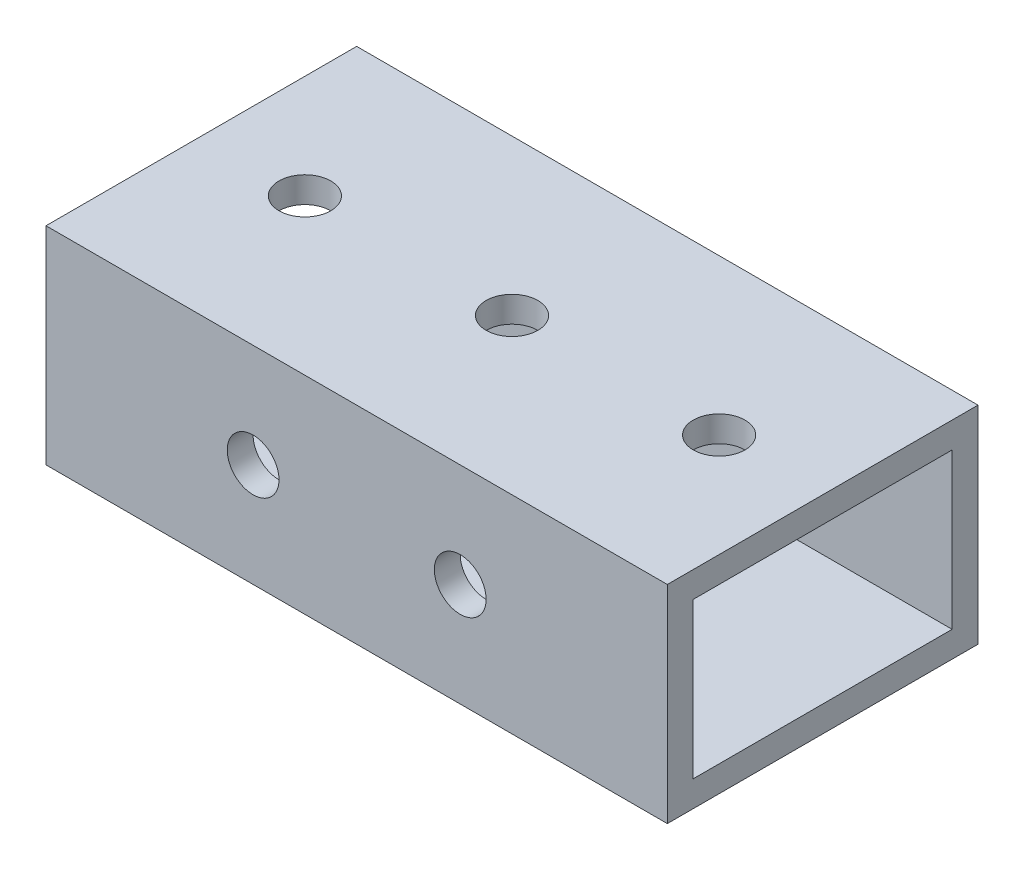
ISO-10303-21;
HEADER;
FILE_DESCRIPTION(('STEP AP214'),'2;1');
FILE_NAME('part.step','',(''),(''),'','','');
FILE_SCHEMA(('AUTOMOTIVE_DESIGN { 1 0 10303 214 1 1 1 1 }'));
ENDSEC;
DATA;
#1=APPLICATION_CONTEXT('core data for automotive mechanical design processes');
#2=APPLICATION_PROTOCOL_DEFINITION('international standard','automotive_design',2000,#1);
#3=PRODUCT_CONTEXT('',#1,'mechanical');
#4=PRODUCT('Part','Part','',(#3));
#5=PRODUCT_RELATED_PRODUCT_CATEGORY('part','',(#4));
#6=PRODUCT_DEFINITION_FORMATION('','',#4);
#7=PRODUCT_DEFINITION_CONTEXT('part definition',#1,'design');
#8=PRODUCT_DEFINITION('design','',#6,#7);
#9=PRODUCT_DEFINITION_SHAPE('','',#8);
#10=(LENGTH_UNIT() NAMED_UNIT(*) SI_UNIT(.MILLI.,.METRE.));
#11=(NAMED_UNIT(*) PLANE_ANGLE_UNIT() SI_UNIT($,.RADIAN.));
#12=(NAMED_UNIT(*) SI_UNIT($,.STERADIAN.) SOLID_ANGLE_UNIT());
#13=UNCERTAINTY_MEASURE_WITH_UNIT(LENGTH_MEASURE(1.E-05),#10,'distance_accuracy_value','');
#14=(GEOMETRIC_REPRESENTATION_CONTEXT(3) GLOBAL_UNCERTAINTY_ASSIGNED_CONTEXT((#13)) GLOBAL_UNIT_ASSIGNED_CONTEXT((#10,
#11,#12)) REPRESENTATION_CONTEXT('',''));
#15=CARTESIAN_POINT('',(0.,0.,0.));
#16=DIRECTION('',(0.,0.,1.));
#17=DIRECTION('',(1.,0.,0.));
#18=AXIS2_PLACEMENT_3D('',#15,#16,#17);
#19=CARTESIAN_POINT('',(38.1,25.4,19.05));
#20=DIRECTION('',(-1.,0.,0.));
#21=DIRECTION('',(0.,0.,1.));
#22=AXIS2_PLACEMENT_3D('',#19,#20,#21);
#23=PLANE('',#22);
#24=DIRECTION('',(0.,0.,1.));
#25=VECTOR('',#24,1.);
#26=CARTESIAN_POINT('',(38.1,22.225,15.875));
#27=LINE('',#26,#25);
#28=CARTESIAN_POINT('',(38.1,22.225,-15.875));
#29=VERTEX_POINT('',#28);
#30=CARTESIAN_POINT('',(38.1,22.225,15.875));
#31=VERTEX_POINT('',#30);
#32=EDGE_CURVE('E115',#29,#31,#27,.T.);
#33=ORIENTED_EDGE('',*,*,#32,.F.);
#34=DIRECTION('',(0.,1.,0.));
#35=VECTOR('',#34,1.);
#36=CARTESIAN_POINT('',(38.1,22.225,-15.875));
#37=LINE('',#36,#35);
#38=CARTESIAN_POINT('',(38.1,3.175,-15.875));
#39=VERTEX_POINT('',#38);
#40=EDGE_CURVE('E53',#39,#29,#37,.T.);
#41=ORIENTED_EDGE('',*,*,#40,.F.);
#42=DIRECTION('',(0.,0.,-1.));
#43=VECTOR('',#42,1.);
#44=CARTESIAN_POINT('',(38.1,3.175,15.875));
#45=LINE('',#44,#43);
#46=CARTESIAN_POINT('',(38.1,3.175,15.875));
#47=VERTEX_POINT('',#46);
#48=EDGE_CURVE('E121',#47,#39,#45,.T.);
#49=ORIENTED_EDGE('',*,*,#48,.F.);
#50=DIRECTION('',(0.,-1.,0.));
#51=VECTOR('',#50,1.);
#52=CARTESIAN_POINT('',(38.1,22.225,15.875));
#53=LINE('',#52,#51);
#54=EDGE_CURVE('E106',#31,#47,#53,.T.);
#55=ORIENTED_EDGE('',*,*,#54,.F.);
#56=EDGE_LOOP('',(#33,#41,#49,#55));
#57=FACE_BOUND('',#56,.T.);
#58=DIRECTION('',(0.,0.,-1.));
#59=VECTOR('',#58,1.);
#60=CARTESIAN_POINT('',(38.1,0.,19.05));
#61=LINE('',#60,#59);
#62=CARTESIAN_POINT('',(38.1,0.,19.05));
#63=VERTEX_POINT('',#62);
#64=CARTESIAN_POINT('',(38.1,0.,-19.05));
#65=VERTEX_POINT('',#64);
#66=EDGE_CURVE('E128',#63,#65,#61,.T.);
#67=ORIENTED_EDGE('',*,*,#66,.T.);
#68=DIRECTION('',(0.,-1.,0.));
#69=VECTOR('',#68,1.);
#70=CARTESIAN_POINT('',(38.1,25.4,-19.05));
#71=LINE('',#70,#69);
#72=CARTESIAN_POINT('',(38.1,25.4,-19.05));
#73=VERTEX_POINT('',#72);
#74=EDGE_CURVE('E157',#73,#65,#71,.T.);
#75=ORIENTED_EDGE('',*,*,#74,.F.);
#76=DIRECTION('',(0.,0.,-1.));
#77=VECTOR('',#76,1.);
#78=CARTESIAN_POINT('',(38.1,25.4,19.05));
#79=LINE('',#78,#77);
#80=CARTESIAN_POINT('',(38.1,25.4,19.05));
#81=VERTEX_POINT('',#80);
#82=EDGE_CURVE('E131',#81,#73,#79,.T.);
#83=ORIENTED_EDGE('',*,*,#82,.F.);
#84=DIRECTION('',(0.,-1.,0.));
#85=VECTOR('',#84,1.);
#86=CARTESIAN_POINT('',(38.1,25.4,19.05));
#87=LINE('',#86,#85);
#88=EDGE_CURVE('E141',#81,#63,#87,.T.);
#89=ORIENTED_EDGE('',*,*,#88,.T.);
#90=EDGE_LOOP('',(#67,#75,#83,#89));
#91=FACE_BOUND('',#90,.T.);
#92=ADVANCED_FACE('F39',(#57,#91),#23,.F.);
#93=CARTESIAN_POINT('',(-38.1,25.4,-19.05));
#94=DIRECTION('',(0.,0.,1.));
#95=DIRECTION('',(1.,0.,0.));
#96=AXIS2_PLACEMENT_3D('',#93,#94,#95);
#97=PLANE('',#96);
#98=CARTESIAN_POINT('',(12.7,12.7,-19.05));
#99=DIRECTION('',(0.,0.,1.));
#100=DIRECTION('',(1.,0.,0.));
#101=AXIS2_PLACEMENT_3D('',#98,#99,#100);
#102=CIRCLE('',#101,3.175);
#103=CARTESIAN_POINT('',(15.875,12.7,-19.05));
#104=VERTEX_POINT('',#103);
#105=EDGE_CURVE('E277',#104,#104,#102,.T.);
#106=ORIENTED_EDGE('',*,*,#105,.T.);
#107=EDGE_LOOP('',(#106));
#108=FACE_BOUND('',#107,.T.);
#109=CARTESIAN_POINT('',(-12.7,12.7,-19.05));
#110=DIRECTION('',(0.,0.,1.));
#111=DIRECTION('',(1.,0.,0.));
#112=AXIS2_PLACEMENT_3D('',#109,#110,#111);
#113=CIRCLE('',#112,3.175);
#114=CARTESIAN_POINT('',(-9.525,12.7,-19.05));
#115=VERTEX_POINT('',#114);
#116=EDGE_CURVE('E271',#115,#115,#113,.T.);
#117=ORIENTED_EDGE('',*,*,#116,.T.);
#118=EDGE_LOOP('',(#117));
#119=FACE_BOUND('',#118,.T.);
#120=DIRECTION('',(-1.,0.,0.));
#121=VECTOR('',#120,1.);
#122=CARTESIAN_POINT('',(-38.1,0.,-19.05));
#123=LINE('',#122,#121);
#124=CARTESIAN_POINT('',(-38.1,0.,-19.05));
#125=VERTEX_POINT('',#124);
#126=EDGE_CURVE('E144',#65,#125,#123,.T.);
#127=ORIENTED_EDGE('',*,*,#126,.T.);
#128=DIRECTION('',(0.,-1.,0.));
#129=VECTOR('',#128,1.);
#130=CARTESIAN_POINT('',(-38.1,25.4,-19.05));
#131=LINE('',#130,#129);
#132=CARTESIAN_POINT('',(-38.1,25.4,-19.05));
#133=VERTEX_POINT('',#132);
#134=EDGE_CURVE('E154',#133,#125,#131,.T.);
#135=ORIENTED_EDGE('',*,*,#134,.F.);
#136=DIRECTION('',(-1.,0.,0.));
#137=VECTOR('',#136,1.);
#138=CARTESIAN_POINT('',(-38.1,25.4,-19.05));
#139=LINE('',#138,#137);
#140=EDGE_CURVE('E134',#73,#133,#139,.T.);
#141=ORIENTED_EDGE('',*,*,#140,.F.);
#142=ORIENTED_EDGE('',*,*,#74,.T.);
#143=EDGE_LOOP('',(#127,#135,#141,#142));
#144=FACE_BOUND('',#143,.T.);
#145=ADVANCED_FACE('F190',(#108,#119,#144),#97,.F.);
#146=CARTESIAN_POINT('',(-38.1,25.4,19.05));
#147=DIRECTION('',(1.,0.,0.));
#148=DIRECTION('',(0.,0.,-1.));
#149=AXIS2_PLACEMENT_3D('',#146,#147,#148);
#150=PLANE('',#149);
#151=DIRECTION('',(0.,0.,-1.));
#152=VECTOR('',#151,1.);
#153=CARTESIAN_POINT('',(-38.1,3.175,19.05));
#154=LINE('',#153,#152);
#155=CARTESIAN_POINT('',(-38.1,3.175,15.875));
#156=VERTEX_POINT('',#155);
#157=CARTESIAN_POINT('',(-38.1,3.175,-15.875));
#158=VERTEX_POINT('',#157);
#159=EDGE_CURVE('E46',#156,#158,#154,.T.);
#160=ORIENTED_EDGE('',*,*,#159,.T.);
#161=DIRECTION('',(0.,1.,0.));
#162=VECTOR('',#161,1.);
#163=CARTESIAN_POINT('',(-38.1,25.4,-15.875));
#164=LINE('',#163,#162);
#165=CARTESIAN_POINT('',(-38.1,22.225,-15.875));
#166=VERTEX_POINT('',#165);
#167=EDGE_CURVE('E11',#158,#166,#164,.T.);
#168=ORIENTED_EDGE('',*,*,#167,.T.);
#169=DIRECTION('',(0.,0.,1.));
#170=VECTOR('',#169,1.);
#171=CARTESIAN_POINT('',(-38.1,22.225,19.05));
#172=LINE('',#171,#170);
#173=CARTESIAN_POINT('',(-38.1,22.225,15.875));
#174=VERTEX_POINT('',#173);
#175=EDGE_CURVE('E160',#166,#174,#172,.T.);
#176=ORIENTED_EDGE('',*,*,#175,.T.);
#177=DIRECTION('',(0.,-1.,0.));
#178=VECTOR('',#177,1.);
#179=CARTESIAN_POINT('',(-38.1,25.4,15.875));
#180=LINE('',#179,#178);
#181=EDGE_CURVE('E109',#174,#156,#180,.T.);
#182=ORIENTED_EDGE('',*,*,#181,.T.);
#183=EDGE_LOOP('',(#160,#168,#176,#182));
#184=FACE_BOUND('',#183,.T.);
#185=DIRECTION('',(0.,0.,1.));
#186=VECTOR('',#185,1.);
#187=CARTESIAN_POINT('',(-38.1,0.,19.05));
#188=LINE('',#187,#186);
#189=CARTESIAN_POINT('',(-38.1,0.,19.05));
#190=VERTEX_POINT('',#189);
#191=EDGE_CURVE('E146',#125,#190,#188,.T.);
#192=ORIENTED_EDGE('',*,*,#191,.T.);
#193=DIRECTION('',(0.,-1.,0.));
#194=VECTOR('',#193,1.);
#195=CARTESIAN_POINT('',(-38.1,25.4,19.05));
#196=LINE('',#195,#194);
#197=CARTESIAN_POINT('',(-38.1,25.4,19.05));
#198=VERTEX_POINT('',#197);
#199=EDGE_CURVE('E151',#198,#190,#196,.T.);
#200=ORIENTED_EDGE('',*,*,#199,.F.);
#201=DIRECTION('',(0.,0.,1.));
#202=VECTOR('',#201,1.);
#203=CARTESIAN_POINT('',(-38.1,25.4,19.05));
#204=LINE('',#203,#202);
#205=EDGE_CURVE('E137',#133,#198,#204,.T.);
#206=ORIENTED_EDGE('',*,*,#205,.F.);
#207=ORIENTED_EDGE('',*,*,#134,.T.);
#208=EDGE_LOOP('',(#192,#200,#206,#207));
#209=FACE_BOUND('',#208,.T.);
#210=ADVANCED_FACE('F164',(#184,#209),#150,.F.);
#211=CARTESIAN_POINT('',(-38.1,25.4,19.05));
#212=DIRECTION('',(0.,0.,-1.));
#213=DIRECTION('',(-1.,0.,0.));
#214=AXIS2_PLACEMENT_3D('',#211,#212,#213);
#215=PLANE('',#214);
#216=CARTESIAN_POINT('',(12.7,12.7,19.05));
#217=DIRECTION('',(0.,0.,1.));
#218=DIRECTION('',(1.,0.,0.));
#219=AXIS2_PLACEMENT_3D('',#216,#217,#218);
#220=CIRCLE('',#219,3.175);
#221=CARTESIAN_POINT('',(15.875,12.7,19.05));
#222=VERTEX_POINT('',#221);
#223=EDGE_CURVE('E265',#222,#222,#220,.T.);
#224=ORIENTED_EDGE('',*,*,#223,.F.);
#225=EDGE_LOOP('',(#224));
#226=FACE_BOUND('',#225,.T.);
#227=CARTESIAN_POINT('',(-12.7,12.7,19.05));
#228=DIRECTION('',(0.,0.,1.));
#229=DIRECTION('',(1.,0.,0.));
#230=AXIS2_PLACEMENT_3D('',#227,#228,#229);
#231=CIRCLE('',#230,3.175);
#232=CARTESIAN_POINT('',(-9.525,12.7,19.05));
#233=VERTEX_POINT('',#232);
#234=EDGE_CURVE('E259',#233,#233,#231,.T.);
#235=ORIENTED_EDGE('',*,*,#234,.F.);
#236=EDGE_LOOP('',(#235));
#237=FACE_BOUND('',#236,.T.);
#238=DIRECTION('',(1.,0.,0.));
#239=VECTOR('',#238,1.);
#240=CARTESIAN_POINT('',(-38.1,0.,19.05));
#241=LINE('',#240,#239);
#242=EDGE_CURVE('E135',#190,#63,#241,.T.);
#243=ORIENTED_EDGE('',*,*,#242,.T.);
#244=ORIENTED_EDGE('',*,*,#88,.F.);
#245=DIRECTION('',(1.,0.,0.));
#246=VECTOR('',#245,1.);
#247=CARTESIAN_POINT('',(-38.1,25.4,19.05));
#248=LINE('',#247,#246);
#249=EDGE_CURVE('E139',#198,#81,#248,.T.);
#250=ORIENTED_EDGE('',*,*,#249,.F.);
#251=ORIENTED_EDGE('',*,*,#199,.T.);
#252=EDGE_LOOP('',(#243,#244,#250,#251));
#253=FACE_BOUND('',#252,.T.);
#254=ADVANCED_FACE('F198',(#226,#237,#253),#215,.F.);
#255=CARTESIAN_POINT('',(0.,25.4,0.));
#256=DIRECTION('',(0.,-1.,0.));
#257=DIRECTION('',(0.,0.,-1.));
#258=AXIS2_PLACEMENT_3D('',#255,#256,#257);
#259=PLANE('',#258);
#260=CARTESIAN_POINT('',(25.4,25.4,0.));
#261=DIRECTION('',(0.,1.,0.));
#262=DIRECTION('',(0.,0.,1.));
#263=AXIS2_PLACEMENT_3D('',#260,#261,#262);
#264=CIRCLE('',#263,3.175);
#265=CARTESIAN_POINT('',(25.4,25.4,3.175));
#266=VERTEX_POINT('',#265);
#267=EDGE_CURVE('E214',#266,#266,#264,.T.);
#268=ORIENTED_EDGE('',*,*,#267,.F.);
#269=EDGE_LOOP('',(#268));
#270=FACE_BOUND('',#269,.T.);
#271=CARTESIAN_POINT('',(0.,25.4,0.));
#272=DIRECTION('',(0.,1.,0.));
#273=DIRECTION('',(0.,0.,1.));
#274=AXIS2_PLACEMENT_3D('',#271,#272,#273);
#275=CIRCLE('',#274,3.175);
#276=CARTESIAN_POINT('',(0.,25.4,3.17499999999999));
#277=VERTEX_POINT('',#276);
#278=EDGE_CURVE('E218',#277,#277,#275,.T.);
#279=ORIENTED_EDGE('',*,*,#278,.F.);
#280=EDGE_LOOP('',(#279));
#281=FACE_BOUND('',#280,.T.);
#282=CARTESIAN_POINT('',(-25.4,25.4,0.));
#283=DIRECTION('',(0.,1.,0.));
#284=DIRECTION('',(0.,0.,1.));
#285=AXIS2_PLACEMENT_3D('',#282,#283,#284);
#286=CIRCLE('',#285,3.175);
#287=CARTESIAN_POINT('',(-25.4,25.4,3.175));
#288=VERTEX_POINT('',#287);
#289=EDGE_CURVE('E222',#288,#288,#286,.T.);
#290=ORIENTED_EDGE('',*,*,#289,.F.);
#291=EDGE_LOOP('',(#290));
#292=FACE_BOUND('',#291,.T.);
#293=ORIENTED_EDGE('',*,*,#82,.T.);
#294=ORIENTED_EDGE('',*,*,#140,.T.);
#295=ORIENTED_EDGE('',*,*,#205,.T.);
#296=ORIENTED_EDGE('',*,*,#249,.T.);
#297=EDGE_LOOP('',(#293,#294,#295,#296));
#298=FACE_BOUND('',#297,.T.);
#299=ADVANCED_FACE('F182',(#270,#281,#292,#298),#259,.F.);
#300=CARTESIAN_POINT('',(0.,0.,0.));
#301=DIRECTION('',(0.,-1.,0.));
#302=DIRECTION('',(0.,0.,-1.));
#303=AXIS2_PLACEMENT_3D('',#300,#301,#302);
#304=PLANE('',#303);
#305=CARTESIAN_POINT('',(0.,0.,0.));
#306=DIRECTION('',(0.,1.,0.));
#307=DIRECTION('',(0.,0.,1.));
#308=AXIS2_PLACEMENT_3D('',#305,#306,#307);
#309=CIRCLE('',#308,3.175);
#310=CARTESIAN_POINT('',(0.,0.,3.17499999999999));
#311=VERTEX_POINT('',#310);
#312=EDGE_CURVE('E253',#311,#311,#309,.T.);
#313=ORIENTED_EDGE('',*,*,#312,.T.);
#314=EDGE_LOOP('',(#313));
#315=FACE_BOUND('',#314,.T.);
#316=CARTESIAN_POINT('',(-25.4,0.,0.));
#317=DIRECTION('',(0.,1.,0.));
#318=DIRECTION('',(0.,0.,1.));
#319=AXIS2_PLACEMENT_3D('',#316,#317,#318);
#320=CIRCLE('',#319,3.175);
#321=CARTESIAN_POINT('',(-25.4,0.,3.175));
#322=VERTEX_POINT('',#321);
#323=EDGE_CURVE('E247',#322,#322,#320,.T.);
#324=ORIENTED_EDGE('',*,*,#323,.T.);
#325=EDGE_LOOP('',(#324));
#326=FACE_BOUND('',#325,.T.);
#327=ORIENTED_EDGE('',*,*,#66,.F.);
#328=ORIENTED_EDGE('',*,*,#242,.F.);
#329=ORIENTED_EDGE('',*,*,#191,.F.);
#330=ORIENTED_EDGE('',*,*,#126,.F.);
#331=EDGE_LOOP('',(#327,#328,#329,#330));
#332=FACE_BOUND('',#331,.T.);
#333=ADVANCED_FACE('F171',(#315,#326,#332),#304,.T.);
#334=CARTESIAN_POINT('',(-88.9,22.225,-15.875));
#335=DIRECTION('',(0.,0.,-1.));
#336=DIRECTION('',(0.,1.,0.));
#337=AXIS2_PLACEMENT_3D('',#334,#335,#336);
#338=PLANE('',#337);
#339=CARTESIAN_POINT('',(12.7,12.7,-15.875));
#340=DIRECTION('',(0.,0.,1.));
#341=DIRECTION('',(1.,0.,0.));
#342=AXIS2_PLACEMENT_3D('',#339,#340,#341);
#343=CIRCLE('',#342,3.175);
#344=CARTESIAN_POINT('',(15.875,12.7,-15.875));
#345=VERTEX_POINT('',#344);
#346=EDGE_CURVE('E274',#345,#345,#343,.T.);
#347=ORIENTED_EDGE('',*,*,#346,.F.);
#348=EDGE_LOOP('',(#347));
#349=FACE_BOUND('',#348,.T.);
#350=CARTESIAN_POINT('',(-12.7,12.7,-15.875));
#351=DIRECTION('',(0.,0.,1.));
#352=DIRECTION('',(1.,0.,0.));
#353=AXIS2_PLACEMENT_3D('',#350,#351,#352);
#354=CIRCLE('',#353,3.175);
#355=CARTESIAN_POINT('',(-9.525,12.7,-15.875));
#356=VERTEX_POINT('',#355);
#357=EDGE_CURVE('E268',#356,#356,#354,.T.);
#358=ORIENTED_EDGE('',*,*,#357,.F.);
#359=EDGE_LOOP('',(#358));
#360=FACE_BOUND('',#359,.T.);
#361=DIRECTION('',(1.,0.,0.));
#362=VECTOR('',#361,1.);
#363=CARTESIAN_POINT('',(-88.9,3.175,-15.875));
#364=LINE('',#363,#362);
#365=EDGE_CURVE('E126',#158,#39,#364,.T.);
#366=ORIENTED_EDGE('',*,*,#365,.T.);
#367=ORIENTED_EDGE('',*,*,#40,.T.);
#368=DIRECTION('',(1.,0.,0.));
#369=VECTOR('',#368,1.);
#370=CARTESIAN_POINT('',(-88.9,22.225,-15.875));
#371=LINE('',#370,#369);
#372=EDGE_CURVE('E112',#166,#29,#371,.T.);
#373=ORIENTED_EDGE('',*,*,#372,.F.);
#374=ORIENTED_EDGE('',*,*,#167,.F.);
#375=EDGE_LOOP('',(#366,#367,#373,#374));
#376=FACE_BOUND('',#375,.T.);
#377=ADVANCED_FACE('F169',(#349,#360,#376),#338,.F.);
#378=CARTESIAN_POINT('',(-88.9,3.175,15.875));
#379=DIRECTION('',(0.,-1.,0.));
#380=DIRECTION('',(0.,0.,-1.));
#381=AXIS2_PLACEMENT_3D('',#378,#379,#380);
#382=PLANE('',#381);
#383=CARTESIAN_POINT('',(0.,3.175,0.));
#384=DIRECTION('',(0.,1.,0.));
#385=DIRECTION('',(0.,0.,1.));
#386=AXIS2_PLACEMENT_3D('',#383,#384,#385);
#387=CIRCLE('',#386,3.175);
#388=CARTESIAN_POINT('',(0.,3.175,3.17499999999999));
#389=VERTEX_POINT('',#388);
#390=EDGE_CURVE('E250',#389,#389,#387,.T.);
#391=ORIENTED_EDGE('',*,*,#390,.F.);
#392=EDGE_LOOP('',(#391));
#393=FACE_BOUND('',#392,.T.);
#394=CARTESIAN_POINT('',(-25.4,3.175,0.));
#395=DIRECTION('',(0.,1.,0.));
#396=DIRECTION('',(0.,0.,1.));
#397=AXIS2_PLACEMENT_3D('',#394,#395,#396);
#398=CIRCLE('',#397,3.175);
#399=CARTESIAN_POINT('',(-25.4,3.175,3.175));
#400=VERTEX_POINT('',#399);
#401=EDGE_CURVE('E245',#400,#400,#398,.T.);
#402=ORIENTED_EDGE('',*,*,#401,.F.);
#403=EDGE_LOOP('',(#402));
#404=FACE_BOUND('',#403,.T.);
#405=DIRECTION('',(1.,0.,0.));
#406=VECTOR('',#405,1.);
#407=CARTESIAN_POINT('',(-88.9,3.175,15.875));
#408=LINE('',#407,#406);
#409=EDGE_CURVE('E111',#156,#47,#408,.T.);
#410=ORIENTED_EDGE('',*,*,#409,.T.);
#411=ORIENTED_EDGE('',*,*,#48,.T.);
#412=ORIENTED_EDGE('',*,*,#365,.F.);
#413=ORIENTED_EDGE('',*,*,#159,.F.);
#414=EDGE_LOOP('',(#410,#411,#412,#413));
#415=FACE_BOUND('',#414,.T.);
#416=ADVANCED_FACE('F168',(#393,#404,#415),#382,.F.);
#417=CARTESIAN_POINT('',(-88.9,22.225,15.875));
#418=DIRECTION('',(0.,0.,1.));
#419=DIRECTION('',(0.,-1.,0.));
#420=AXIS2_PLACEMENT_3D('',#417,#418,#419);
#421=PLANE('',#420);
#422=CARTESIAN_POINT('',(12.7,12.7,15.875));
#423=DIRECTION('',(0.,0.,1.));
#424=DIRECTION('',(1.,0.,0.));
#425=AXIS2_PLACEMENT_3D('',#422,#423,#424);
#426=CIRCLE('',#425,3.175);
#427=CARTESIAN_POINT('',(15.875,12.7,15.875));
#428=VERTEX_POINT('',#427);
#429=EDGE_CURVE('E262',#428,#428,#426,.T.);
#430=ORIENTED_EDGE('',*,*,#429,.T.);
#431=EDGE_LOOP('',(#430));
#432=FACE_BOUND('',#431,.T.);
#433=CARTESIAN_POINT('',(-12.7,12.7,15.875));
#434=DIRECTION('',(0.,0.,1.));
#435=DIRECTION('',(1.,0.,0.));
#436=AXIS2_PLACEMENT_3D('',#433,#434,#435);
#437=CIRCLE('',#436,3.175);
#438=CARTESIAN_POINT('',(-9.525,12.7,15.875));
#439=VERTEX_POINT('',#438);
#440=EDGE_CURVE('E256',#439,#439,#437,.T.);
#441=ORIENTED_EDGE('',*,*,#440,.T.);
#442=EDGE_LOOP('',(#441));
#443=FACE_BOUND('',#442,.T.);
#444=DIRECTION('',(1.,0.,0.));
#445=VECTOR('',#444,1.);
#446=CARTESIAN_POINT('',(-88.9,22.225,15.875));
#447=LINE('',#446,#445);
#448=EDGE_CURVE('E61',#174,#31,#447,.T.);
#449=ORIENTED_EDGE('',*,*,#448,.T.);
#450=ORIENTED_EDGE('',*,*,#54,.T.);
#451=ORIENTED_EDGE('',*,*,#409,.F.);
#452=ORIENTED_EDGE('',*,*,#181,.F.);
#453=EDGE_LOOP('',(#449,#450,#451,#452));
#454=FACE_BOUND('',#453,.T.);
#455=ADVANCED_FACE('F103',(#432,#443,#454),#421,.F.);
#456=CARTESIAN_POINT('',(-88.9,22.225,15.875));
#457=DIRECTION('',(0.,1.,0.));
#458=DIRECTION('',(0.,0.,1.));
#459=AXIS2_PLACEMENT_3D('',#456,#457,#458);
#460=PLANE('',#459);
#461=CARTESIAN_POINT('',(25.4,22.225,0.));
#462=DIRECTION('',(0.,1.,0.));
#463=DIRECTION('',(0.,0.,1.));
#464=AXIS2_PLACEMENT_3D('',#461,#462,#463);
#465=CIRCLE('',#464,3.175);
#466=CARTESIAN_POINT('',(25.4,22.225,3.175));
#467=VERTEX_POINT('',#466);
#468=EDGE_CURVE('E279',#467,#467,#465,.T.);
#469=ORIENTED_EDGE('',*,*,#468,.T.);
#470=EDGE_LOOP('',(#469));
#471=FACE_BOUND('',#470,.T.);
#472=CARTESIAN_POINT('',(0.,22.225,0.));
#473=DIRECTION('',(0.,1.,0.));
#474=DIRECTION('',(0.,0.,1.));
#475=AXIS2_PLACEMENT_3D('',#472,#473,#474);
#476=CIRCLE('',#475,3.175);
#477=CARTESIAN_POINT('',(0.,22.225,3.17499999999999));
#478=VERTEX_POINT('',#477);
#479=EDGE_CURVE('E241',#478,#478,#476,.T.);
#480=ORIENTED_EDGE('',*,*,#479,.T.);
#481=EDGE_LOOP('',(#480));
#482=FACE_BOUND('',#481,.T.);
#483=CARTESIAN_POINT('',(-25.4,22.225,0.));
#484=DIRECTION('',(0.,1.,0.));
#485=DIRECTION('',(0.,0.,1.));
#486=AXIS2_PLACEMENT_3D('',#483,#484,#485);
#487=CIRCLE('',#486,3.175);
#488=CARTESIAN_POINT('',(-25.4,22.225,3.175));
#489=VERTEX_POINT('',#488);
#490=EDGE_CURVE('E237',#489,#489,#487,.T.);
#491=ORIENTED_EDGE('',*,*,#490,.T.);
#492=EDGE_LOOP('',(#491));
#493=FACE_BOUND('',#492,.T.);
#494=ORIENTED_EDGE('',*,*,#372,.T.);
#495=ORIENTED_EDGE('',*,*,#32,.T.);
#496=ORIENTED_EDGE('',*,*,#448,.F.);
#497=ORIENTED_EDGE('',*,*,#175,.F.);
#498=EDGE_LOOP('',(#494,#495,#496,#497));
#499=FACE_BOUND('',#498,.T.);
#500=ADVANCED_FACE('F116',(#471,#482,#493,#499),#460,.F.);
#501=CARTESIAN_POINT('',(-25.4,22.225,0.));
#502=DIRECTION('',(0.,1.,0.));
#503=DIRECTION('',(0.,0.,1.));
#504=AXIS2_PLACEMENT_3D('',#501,#502,#503);
#505=CYLINDRICAL_SURFACE('',#504,3.175);
#506=ORIENTED_EDGE('',*,*,#490,.F.);
#507=EDGE_LOOP('',(#506));
#508=FACE_BOUND('',#507,.T.);
#509=ORIENTED_EDGE('',*,*,#289,.T.);
#510=EDGE_LOOP('',(#509));
#511=FACE_BOUND('',#510,.T.);
#512=ADVANCED_FACE('F319',(#508,#511),#505,.F.);
#513=CARTESIAN_POINT('',(0.,22.225,0.));
#514=DIRECTION('',(0.,1.,0.));
#515=DIRECTION('',(0.,0.,1.));
#516=AXIS2_PLACEMENT_3D('',#513,#514,#515);
#517=CYLINDRICAL_SURFACE('',#516,3.175);
#518=ORIENTED_EDGE('',*,*,#479,.F.);
#519=EDGE_LOOP('',(#518));
#520=FACE_BOUND('',#519,.T.);
#521=ORIENTED_EDGE('',*,*,#278,.T.);
#522=EDGE_LOOP('',(#521));
#523=FACE_BOUND('',#522,.T.);
#524=ADVANCED_FACE('F315',(#520,#523),#517,.F.);
#525=CARTESIAN_POINT('',(-25.4,3.175,0.));
#526=DIRECTION('',(0.,-1.,0.));
#527=DIRECTION('',(0.,0.,-1.));
#528=AXIS2_PLACEMENT_3D('',#525,#526,#527);
#529=CYLINDRICAL_SURFACE('',#528,3.175);
#530=ORIENTED_EDGE('',*,*,#401,.T.);
#531=EDGE_LOOP('',(#530));
#532=FACE_BOUND('',#531,.T.);
#533=ORIENTED_EDGE('',*,*,#323,.F.);
#534=EDGE_LOOP('',(#533));
#535=FACE_BOUND('',#534,.T.);
#536=ADVANCED_FACE('F311',(#532,#535),#529,.F.);
#537=CARTESIAN_POINT('',(0.,3.175,0.));
#538=DIRECTION('',(0.,-1.,0.));
#539=DIRECTION('',(0.,0.,-1.));
#540=AXIS2_PLACEMENT_3D('',#537,#538,#539);
#541=CYLINDRICAL_SURFACE('',#540,3.175);
#542=ORIENTED_EDGE('',*,*,#390,.T.);
#543=EDGE_LOOP('',(#542));
#544=FACE_BOUND('',#543,.T.);
#545=ORIENTED_EDGE('',*,*,#312,.F.);
#546=EDGE_LOOP('',(#545));
#547=FACE_BOUND('',#546,.T.);
#548=ADVANCED_FACE('F307',(#544,#547),#541,.F.);
#549=CARTESIAN_POINT('',(-12.7,12.7,15.875));
#550=DIRECTION('',(0.,0.,1.));
#551=DIRECTION('',(1.,0.,0.));
#552=AXIS2_PLACEMENT_3D('',#549,#550,#551);
#553=CYLINDRICAL_SURFACE('',#552,3.175);
#554=ORIENTED_EDGE('',*,*,#440,.F.);
#555=EDGE_LOOP('',(#554));
#556=FACE_BOUND('',#555,.T.);
#557=ORIENTED_EDGE('',*,*,#234,.T.);
#558=EDGE_LOOP('',(#557));
#559=FACE_BOUND('',#558,.T.);
#560=ADVANCED_FACE('F303',(#556,#559),#553,.F.);
#561=CARTESIAN_POINT('',(12.7,12.7,15.875));
#562=DIRECTION('',(0.,0.,1.));
#563=DIRECTION('',(1.,0.,0.));
#564=AXIS2_PLACEMENT_3D('',#561,#562,#563);
#565=CYLINDRICAL_SURFACE('',#564,3.175);
#566=ORIENTED_EDGE('',*,*,#429,.F.);
#567=EDGE_LOOP('',(#566));
#568=FACE_BOUND('',#567,.T.);
#569=ORIENTED_EDGE('',*,*,#223,.T.);
#570=EDGE_LOOP('',(#569));
#571=FACE_BOUND('',#570,.T.);
#572=ADVANCED_FACE('F300',(#568,#571),#565,.F.);
#573=CARTESIAN_POINT('',(-12.7,12.7,-15.875));
#574=DIRECTION('',(0.,0.,-1.));
#575=DIRECTION('',(-1.,0.,0.));
#576=AXIS2_PLACEMENT_3D('',#573,#574,#575);
#577=CYLINDRICAL_SURFACE('',#576,3.175);
#578=ORIENTED_EDGE('',*,*,#357,.T.);
#579=EDGE_LOOP('',(#578));
#580=FACE_BOUND('',#579,.T.);
#581=ORIENTED_EDGE('',*,*,#116,.F.);
#582=EDGE_LOOP('',(#581));
#583=FACE_BOUND('',#582,.T.);
#584=ADVANCED_FACE('F295',(#580,#583),#577,.F.);
#585=CARTESIAN_POINT('',(12.7,12.7,-15.875));
#586=DIRECTION('',(0.,0.,-1.));
#587=DIRECTION('',(-1.,0.,0.));
#588=AXIS2_PLACEMENT_3D('',#585,#586,#587);
#589=CYLINDRICAL_SURFACE('',#588,3.175);
#590=ORIENTED_EDGE('',*,*,#346,.T.);
#591=EDGE_LOOP('',(#590));
#592=FACE_BOUND('',#591,.T.);
#593=ORIENTED_EDGE('',*,*,#105,.F.);
#594=EDGE_LOOP('',(#593));
#595=FACE_BOUND('',#594,.T.);
#596=ADVANCED_FACE('F291',(#592,#595),#589,.F.);
#597=CARTESIAN_POINT('',(25.4,22.225,0.));
#598=DIRECTION('',(0.,1.,0.));
#599=DIRECTION('',(0.,0.,1.));
#600=AXIS2_PLACEMENT_3D('',#597,#598,#599);
#601=CYLINDRICAL_SURFACE('',#600,3.175);
#602=ORIENTED_EDGE('',*,*,#468,.F.);
#603=EDGE_LOOP('',(#602));
#604=FACE_BOUND('',#603,.T.);
#605=ORIENTED_EDGE('',*,*,#267,.T.);
#606=EDGE_LOOP('',(#605));
#607=FACE_BOUND('',#606,.T.);
#608=ADVANCED_FACE('F288',(#604,#607),#601,.F.);
#609=CLOSED_SHELL('',(#92,#145,#210,#254,#299,#333,#377,#416,#455,#500,#512,#524,#536,#548,#560,
#572,#584,#596,#608));
#610=MANIFOLD_SOLID_BREP('B2',#609);
#611=ADVANCED_BREP_SHAPE_REPRESENTATION('',(#18,#610),#14);
#612=SHAPE_DEFINITION_REPRESENTATION(#9,#611);
ENDSEC;
END-ISO-10303-21;
